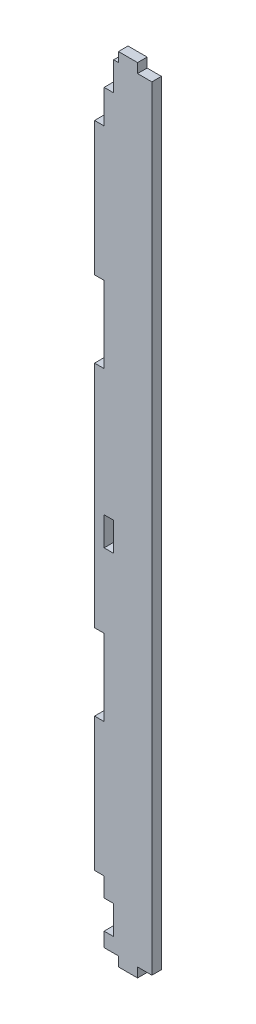
ISO-10303-21;
HEADER;
FILE_DESCRIPTION(('STEP AP214'),'2;1');
FILE_NAME('part.step','',(''),(''),'','','');
FILE_SCHEMA(('AUTOMOTIVE_DESIGN { 1 0 10303 214 1 1 1 1 }'));
ENDSEC;
DATA;
#1=APPLICATION_CONTEXT('core data for automotive mechanical design processes');
#2=APPLICATION_PROTOCOL_DEFINITION('international standard','automotive_design',2000,#1);
#3=PRODUCT_CONTEXT('',#1,'mechanical');
#4=PRODUCT('Part','Part','',(#3));
#5=PRODUCT_RELATED_PRODUCT_CATEGORY('part','',(#4));
#6=PRODUCT_DEFINITION_FORMATION('','',#4);
#7=PRODUCT_DEFINITION_CONTEXT('part definition',#1,'design');
#8=PRODUCT_DEFINITION('design','',#6,#7);
#9=PRODUCT_DEFINITION_SHAPE('','',#8);
#10=(LENGTH_UNIT() NAMED_UNIT(*) SI_UNIT(.MILLI.,.METRE.));
#11=(NAMED_UNIT(*) PLANE_ANGLE_UNIT() SI_UNIT($,.RADIAN.));
#12=(NAMED_UNIT(*) SI_UNIT($,.STERADIAN.) SOLID_ANGLE_UNIT());
#13=UNCERTAINTY_MEASURE_WITH_UNIT(LENGTH_MEASURE(1.E-05),#10,'distance_accuracy_value','');
#14=(GEOMETRIC_REPRESENTATION_CONTEXT(3) GLOBAL_UNCERTAINTY_ASSIGNED_CONTEXT((#13)) GLOBAL_UNIT_ASSIGNED_CONTEXT((#10,
#11,#12)) REPRESENTATION_CONTEXT('',''));
#15=CARTESIAN_POINT('',(0.,0.,0.));
#16=DIRECTION('',(0.,0.,1.));
#17=DIRECTION('',(1.,0.,0.));
#18=AXIS2_PLACEMENT_3D('',#15,#16,#17);
#19=CARTESIAN_POINT('',(0.,-472.5,5.));
#20=DIRECTION('',(0.,-1.,0.));
#21=DIRECTION('',(0.,0.,-1.));
#22=AXIS2_PLACEMENT_3D('',#19,#20,#21);
#23=PLANE('',#22);
#24=DIRECTION('',(-1.,0.,0.));
#25=VECTOR('',#24,1.);
#26=CARTESIAN_POINT('',(0.,-472.5,0.));
#27=LINE('',#26,#25);
#28=CARTESIAN_POINT('',(-435.,-472.5,0.));
#29=VERTEX_POINT('',#28);
#30=CARTESIAN_POINT('',(-440.,-472.5,0.));
#31=VERTEX_POINT('',#30);
#32=EDGE_CURVE('E305',#29,#31,#27,.T.);
#33=ORIENTED_EDGE('',*,*,#32,.T.);
#34=DIRECTION('',(0.,0.,-1.));
#35=VECTOR('',#34,1.);
#36=CARTESIAN_POINT('',(-440.,-472.5,5.));
#37=LINE('',#36,#35);
#38=CARTESIAN_POINT('',(-440.,-472.5,5.));
#39=VERTEX_POINT('',#38);
#40=EDGE_CURVE('E11',#39,#31,#37,.T.);
#41=ORIENTED_EDGE('',*,*,#40,.F.);
#42=DIRECTION('',(-1.,0.,0.));
#43=VECTOR('',#42,1.);
#44=CARTESIAN_POINT('',(0.,-472.5,5.));
#45=LINE('',#44,#43);
#46=CARTESIAN_POINT('',(-435.,-472.5,5.));
#47=VERTEX_POINT('',#46);
#48=EDGE_CURVE('E469',#47,#39,#45,.T.);
#49=ORIENTED_EDGE('',*,*,#48,.F.);
#50=DIRECTION('',(0.,0.,-1.));
#51=VECTOR('',#50,1.);
#52=CARTESIAN_POINT('',(-435.,-472.5,5.));
#53=LINE('',#52,#51);
#54=EDGE_CURVE('E382',#47,#29,#53,.T.);
#55=ORIENTED_EDGE('',*,*,#54,.T.);
#56=EDGE_LOOP('',(#33,#41,#49,#55));
#57=FACE_BOUND('',#56,.T.);
#58=ADVANCED_FACE('F39',(#57),#23,.F.);
#59=CARTESIAN_POINT('',(-439.999999999983,1.62832710278351E-11,5.));
#60=DIRECTION('',(1.,0.,0.));
#61=DIRECTION('',(0.,1.,0.));
#62=AXIS2_PLACEMENT_3D('',#59,#60,#61);
#63=PLANE('',#62);
#64=DIRECTION('',(0.,-1.,0.));
#65=VECTOR('',#64,1.);
#66=CARTESIAN_POINT('',(-439.999999999983,1.62832710278351E-11,0.));
#67=LINE('',#66,#65);
#68=CARTESIAN_POINT('',(-440.000000000001,-480.,0.));
#69=VERTEX_POINT('',#68);
#70=EDGE_CURVE('E308',#31,#69,#67,.T.);
#71=ORIENTED_EDGE('',*,*,#70,.T.);
#72=DIRECTION('',(0.,0.,-1.));
#73=VECTOR('',#72,1.);
#74=CARTESIAN_POINT('',(-440.000000000001,-480.,5.));
#75=LINE('',#74,#73);
#76=CARTESIAN_POINT('',(-440.000000000001,-480.,5.));
#77=VERTEX_POINT('',#76);
#78=EDGE_CURVE('E49',#77,#69,#75,.T.);
#79=ORIENTED_EDGE('',*,*,#78,.F.);
#80=DIRECTION('',(0.,-1.,0.));
#81=VECTOR('',#80,1.);
#82=CARTESIAN_POINT('',(-439.999999999983,1.62832710278351E-11,5.));
#83=LINE('',#82,#81);
#84=EDGE_CURVE('E472',#39,#77,#83,.T.);
#85=ORIENTED_EDGE('',*,*,#84,.F.);
#86=ORIENTED_EDGE('',*,*,#40,.T.);
#87=EDGE_LOOP('',(#71,#79,#85,#86));
#88=FACE_BOUND('',#87,.T.);
#89=ADVANCED_FACE('F556',(#88),#63,.F.);
#90=CARTESIAN_POINT('',(0.,-480.,5.));
#91=DIRECTION('',(0.,-1.,0.));
#92=DIRECTION('',(0.,0.,-1.));
#93=AXIS2_PLACEMENT_3D('',#90,#91,#92);
#94=PLANE('',#93);
#95=DIRECTION('',(-1.,0.,0.));
#96=VECTOR('',#95,1.);
#97=CARTESIAN_POINT('',(0.,-480.,0.));
#98=LINE('',#97,#96);
#99=CARTESIAN_POINT('',(-432.500000000001,-480.,0.));
#100=VERTEX_POINT('',#99);
#101=EDGE_CURVE('E311',#100,#69,#98,.T.);
#102=ORIENTED_EDGE('',*,*,#101,.F.);
#103=DIRECTION('',(0.,0.,-1.));
#104=VECTOR('',#103,1.);
#105=CARTESIAN_POINT('',(-432.500000000001,-480.,5.));
#106=LINE('',#105,#104);
#107=CARTESIAN_POINT('',(-432.500000000001,-480.,5.));
#108=VERTEX_POINT('',#107);
#109=EDGE_CURVE('E440',#108,#100,#106,.T.);
#110=ORIENTED_EDGE('',*,*,#109,.F.);
#111=DIRECTION('',(-1.,0.,0.));
#112=VECTOR('',#111,1.);
#113=CARTESIAN_POINT('',(0.,-480.,5.));
#114=LINE('',#113,#112);
#115=EDGE_CURVE('E478',#108,#77,#114,.T.);
#116=ORIENTED_EDGE('',*,*,#115,.T.);
#117=ORIENTED_EDGE('',*,*,#78,.T.);
#118=EDGE_LOOP('',(#102,#110,#116,#117));
#119=FACE_BOUND('',#118,.T.);
#120=ADVANCED_FACE('F561',(#119),#94,.T.);
#121=CARTESIAN_POINT('',(-432.500000000001,0.,5.));
#122=DIRECTION('',(-1.,0.,0.));
#123=DIRECTION('',(0.,0.,1.));
#124=AXIS2_PLACEMENT_3D('',#121,#122,#123);
#125=PLANE('',#124);
#126=DIRECTION('',(0.,1.,0.));
#127=VECTOR('',#126,1.);
#128=CARTESIAN_POINT('',(-432.500000000001,0.,0.));
#129=LINE('',#128,#127);
#130=CARTESIAN_POINT('',(-432.500000000001,-485.,0.));
#131=VERTEX_POINT('',#130);
#132=EDGE_CURVE('E314',#131,#100,#129,.T.);
#133=ORIENTED_EDGE('',*,*,#132,.F.);
#134=DIRECTION('',(0.,0.,-1.));
#135=VECTOR('',#134,1.);
#136=CARTESIAN_POINT('',(-432.500000000001,-485.,5.));
#137=LINE('',#136,#135);
#138=CARTESIAN_POINT('',(-432.500000000001,-485.,5.));
#139=VERTEX_POINT('',#138);
#140=EDGE_CURVE('E438',#139,#131,#137,.T.);
#141=ORIENTED_EDGE('',*,*,#140,.F.);
#142=DIRECTION('',(0.,1.,0.));
#143=VECTOR('',#142,1.);
#144=CARTESIAN_POINT('',(-432.500000000001,0.,5.));
#145=LINE('',#144,#143);
#146=EDGE_CURVE('E481',#139,#108,#145,.T.);
#147=ORIENTED_EDGE('',*,*,#146,.T.);
#148=ORIENTED_EDGE('',*,*,#109,.T.);
#149=EDGE_LOOP('',(#133,#141,#147,#148));
#150=FACE_BOUND('',#149,.T.);
#151=ADVANCED_FACE('F668',(#150),#125,.T.);
#152=CARTESIAN_POINT('',(0.,-485.,5.));
#153=DIRECTION('',(0.,-1.,0.));
#154=DIRECTION('',(0.,0.,-1.));
#155=AXIS2_PLACEMENT_3D('',#152,#153,#154);
#156=PLANE('',#155);
#157=DIRECTION('',(-1.,0.,0.));
#158=VECTOR('',#157,1.);
#159=CARTESIAN_POINT('',(0.,-485.,0.));
#160=LINE('',#159,#158);
#161=CARTESIAN_POINT('',(-422.500000000001,-485.,0.));
#162=VERTEX_POINT('',#161);
#163=EDGE_CURVE('E317',#162,#131,#160,.T.);
#164=ORIENTED_EDGE('',*,*,#163,.F.);
#165=DIRECTION('',(0.,0.,-1.));
#166=VECTOR('',#165,1.);
#167=CARTESIAN_POINT('',(-422.500000000001,-485.,5.));
#168=LINE('',#167,#166);
#169=CARTESIAN_POINT('',(-422.500000000001,-485.,5.));
#170=VERTEX_POINT('',#169);
#171=EDGE_CURVE('E436',#170,#162,#168,.T.);
#172=ORIENTED_EDGE('',*,*,#171,.F.);
#173=DIRECTION('',(-1.,0.,0.));
#174=VECTOR('',#173,1.);
#175=CARTESIAN_POINT('',(0.,-485.,5.));
#176=LINE('',#175,#174);
#177=EDGE_CURVE('E484',#170,#139,#176,.T.);
#178=ORIENTED_EDGE('',*,*,#177,.T.);
#179=ORIENTED_EDGE('',*,*,#140,.T.);
#180=EDGE_LOOP('',(#164,#172,#178,#179));
#181=FACE_BOUND('',#180,.T.);
#182=ADVANCED_FACE('F664',(#181),#156,.T.);
#183=CARTESIAN_POINT('',(-422.500000000001,0.,5.));
#184=DIRECTION('',(1.,0.,0.));
#185=DIRECTION('',(0.,0.,-1.));
#186=AXIS2_PLACEMENT_3D('',#183,#184,#185);
#187=PLANE('',#186);
#188=DIRECTION('',(0.,-1.,0.));
#189=VECTOR('',#188,1.);
#190=CARTESIAN_POINT('',(-422.500000000001,0.,0.));
#191=LINE('',#190,#189);
#192=CARTESIAN_POINT('',(-422.500000000001,-480.,0.));
#193=VERTEX_POINT('',#192);
#194=EDGE_CURVE('E320',#193,#162,#191,.T.);
#195=ORIENTED_EDGE('',*,*,#194,.F.);
#196=DIRECTION('',(0.,0.,-1.));
#197=VECTOR('',#196,1.);
#198=CARTESIAN_POINT('',(-422.500000000001,-480.,5.));
#199=LINE('',#198,#197);
#200=CARTESIAN_POINT('',(-422.500000000001,-480.,5.));
#201=VERTEX_POINT('',#200);
#202=EDGE_CURVE('E434',#201,#193,#199,.T.);
#203=ORIENTED_EDGE('',*,*,#202,.F.);
#204=DIRECTION('',(0.,-1.,0.));
#205=VECTOR('',#204,1.);
#206=CARTESIAN_POINT('',(-422.500000000001,0.,5.));
#207=LINE('',#206,#205);
#208=EDGE_CURVE('E487',#201,#170,#207,.T.);
#209=ORIENTED_EDGE('',*,*,#208,.T.);
#210=ORIENTED_EDGE('',*,*,#171,.T.);
#211=EDGE_LOOP('',(#195,#203,#209,#210));
#212=FACE_BOUND('',#211,.T.);
#213=ADVANCED_FACE('F660',(#212),#187,.T.);
#214=CARTESIAN_POINT('',(0.,-480.,5.));
#215=DIRECTION('',(0.,1.,0.));
#216=DIRECTION('',(0.,0.,1.));
#217=AXIS2_PLACEMENT_3D('',#214,#215,#216);
#218=PLANE('',#217);
#219=DIRECTION('',(1.,0.,0.));
#220=VECTOR('',#219,1.);
#221=CARTESIAN_POINT('',(0.,-480.,0.));
#222=LINE('',#221,#220);
#223=CARTESIAN_POINT('',(-415.000000000001,-480.,0.));
#224=VERTEX_POINT('',#223);
#225=EDGE_CURVE('E323',#193,#224,#222,.T.);
#226=ORIENTED_EDGE('',*,*,#225,.T.);
#227=DIRECTION('',(0.,0.,-1.));
#228=VECTOR('',#227,1.);
#229=CARTESIAN_POINT('',(-415.000000000001,-480.,5.));
#230=LINE('',#229,#228);
#231=CARTESIAN_POINT('',(-415.000000000001,-480.,5.));
#232=VERTEX_POINT('',#231);
#233=EDGE_CURVE('E432',#232,#224,#230,.T.);
#234=ORIENTED_EDGE('',*,*,#233,.F.);
#235=DIRECTION('',(1.,0.,0.));
#236=VECTOR('',#235,1.);
#237=CARTESIAN_POINT('',(0.,-480.,5.));
#238=LINE('',#237,#236);
#239=EDGE_CURVE('E490',#201,#232,#238,.T.);
#240=ORIENTED_EDGE('',*,*,#239,.F.);
#241=ORIENTED_EDGE('',*,*,#202,.T.);
#242=EDGE_LOOP('',(#226,#234,#240,#241));
#243=FACE_BOUND('',#242,.T.);
#244=ADVANCED_FACE('F656',(#243),#218,.F.);
#245=CARTESIAN_POINT('',(-415.000000000001,0.,5.));
#246=DIRECTION('',(1.,0.,0.));
#247=DIRECTION('',(0.,0.,-1.));
#248=AXIS2_PLACEMENT_3D('',#245,#246,#247);
#249=PLANE('',#248);
#250=DIRECTION('',(0.,-1.,0.));
#251=VECTOR('',#250,1.);
#252=CARTESIAN_POINT('',(-415.000000000001,0.,0.));
#253=LINE('',#252,#251);
#254=CARTESIAN_POINT('',(-415.000000000001,-75.,0.));
#255=VERTEX_POINT('',#254);
#256=EDGE_CURVE('E326',#255,#224,#253,.T.);
#257=ORIENTED_EDGE('',*,*,#256,.F.);
#258=DIRECTION('',(0.,0.,-1.));
#259=VECTOR('',#258,1.);
#260=CARTESIAN_POINT('',(-415.000000000001,-75.,5.));
#261=LINE('',#260,#259);
#262=CARTESIAN_POINT('',(-415.000000000001,-75.,5.));
#263=VERTEX_POINT('',#262);
#264=EDGE_CURVE('E430',#263,#255,#261,.T.);
#265=ORIENTED_EDGE('',*,*,#264,.F.);
#266=DIRECTION('',(0.,-1.,0.));
#267=VECTOR('',#266,1.);
#268=CARTESIAN_POINT('',(-415.000000000001,0.,5.));
#269=LINE('',#268,#267);
#270=EDGE_CURVE('E492',#263,#232,#269,.T.);
#271=ORIENTED_EDGE('',*,*,#270,.T.);
#272=ORIENTED_EDGE('',*,*,#233,.T.);
#273=EDGE_LOOP('',(#257,#265,#271,#272));
#274=FACE_BOUND('',#273,.T.);
#275=ADVANCED_FACE('F652',(#274),#249,.T.);
#276=CARTESIAN_POINT('',(0.,-75.,5.));
#277=DIRECTION('',(0.,1.,0.));
#278=DIRECTION('',(0.,0.,1.));
#279=AXIS2_PLACEMENT_3D('',#276,#277,#278);
#280=PLANE('',#279);
#281=DIRECTION('',(1.,0.,0.));
#282=VECTOR('',#281,1.);
#283=CARTESIAN_POINT('',(0.,-75.,0.));
#284=LINE('',#283,#282);
#285=CARTESIAN_POINT('',(-422.500000000001,-75.,0.));
#286=VERTEX_POINT('',#285);
#287=EDGE_CURVE('E329',#286,#255,#284,.T.);
#288=ORIENTED_EDGE('',*,*,#287,.F.);
#289=DIRECTION('',(0.,0.,-1.));
#290=VECTOR('',#289,1.);
#291=CARTESIAN_POINT('',(-422.500000000001,-75.,5.));
#292=LINE('',#291,#290);
#293=CARTESIAN_POINT('',(-422.500000000001,-75.,5.));
#294=VERTEX_POINT('',#293);
#295=EDGE_CURVE('E428',#294,#286,#292,.T.);
#296=ORIENTED_EDGE('',*,*,#295,.F.);
#297=DIRECTION('',(1.,0.,0.));
#298=VECTOR('',#297,1.);
#299=CARTESIAN_POINT('',(0.,-75.,5.));
#300=LINE('',#299,#298);
#301=EDGE_CURVE('E495',#294,#263,#300,.T.);
#302=ORIENTED_EDGE('',*,*,#301,.T.);
#303=ORIENTED_EDGE('',*,*,#264,.T.);
#304=EDGE_LOOP('',(#288,#296,#302,#303));
#305=FACE_BOUND('',#304,.T.);
#306=ADVANCED_FACE('F648',(#305),#280,.T.);
#307=CARTESIAN_POINT('',(-422.500000000001,0.,5.));
#308=DIRECTION('',(-1.,0.,0.));
#309=DIRECTION('',(0.,0.,1.));
#310=AXIS2_PLACEMENT_3D('',#307,#308,#309);
#311=PLANE('',#310);
#312=DIRECTION('',(0.,1.,0.));
#313=VECTOR('',#312,1.);
#314=CARTESIAN_POINT('',(-422.500000000001,0.,0.));
#315=LINE('',#314,#313);
#316=CARTESIAN_POINT('',(-422.500000000001,-70.,0.));
#317=VERTEX_POINT('',#316);
#318=EDGE_CURVE('E332',#286,#317,#315,.T.);
#319=ORIENTED_EDGE('',*,*,#318,.T.);
#320=DIRECTION('',(0.,0.,-1.));
#321=VECTOR('',#320,1.);
#322=CARTESIAN_POINT('',(-422.500000000001,-70.,5.));
#323=LINE('',#322,#321);
#324=CARTESIAN_POINT('',(-422.500000000001,-70.,5.));
#325=VERTEX_POINT('',#324);
#326=EDGE_CURVE('E425',#325,#317,#323,.T.);
#327=ORIENTED_EDGE('',*,*,#326,.F.);
#328=DIRECTION('',(0.,1.,0.));
#329=VECTOR('',#328,1.);
#330=CARTESIAN_POINT('',(-422.500000000001,0.,5.));
#331=LINE('',#330,#329);
#332=EDGE_CURVE('E498',#294,#325,#331,.T.);
#333=ORIENTED_EDGE('',*,*,#332,.F.);
#334=ORIENTED_EDGE('',*,*,#295,.T.);
#335=EDGE_LOOP('',(#319,#327,#333,#334));
#336=FACE_BOUND('',#335,.T.);
#337=ADVANCED_FACE('F644',(#336),#311,.F.);
#338=CARTESIAN_POINT('',(0.,-70.,5.));
#339=DIRECTION('',(0.,-1.,0.));
#340=DIRECTION('',(0.,0.,-1.));
#341=AXIS2_PLACEMENT_3D('',#338,#339,#340);
#342=PLANE('',#341);
#343=DIRECTION('',(-1.,0.,0.));
#344=VECTOR('',#343,1.);
#345=CARTESIAN_POINT('',(0.,-70.,0.));
#346=LINE('',#345,#344);
#347=CARTESIAN_POINT('',(-432.500000000001,-70.,0.));
#348=VERTEX_POINT('',#347);
#349=EDGE_CURVE('E334',#317,#348,#346,.T.);
#350=ORIENTED_EDGE('',*,*,#349,.T.);
#351=DIRECTION('',(0.,0.,-1.));
#352=VECTOR('',#351,1.);
#353=CARTESIAN_POINT('',(-432.500000000001,-70.,5.));
#354=LINE('',#353,#352);
#355=CARTESIAN_POINT('',(-432.500000000001,-70.,5.));
#356=VERTEX_POINT('',#355);
#357=EDGE_CURVE('E422',#356,#348,#354,.T.);
#358=ORIENTED_EDGE('',*,*,#357,.F.);
#359=DIRECTION('',(-1.,0.,0.));
#360=VECTOR('',#359,1.);
#361=CARTESIAN_POINT('',(0.,-70.,5.));
#362=LINE('',#361,#360);
#363=EDGE_CURVE('E500',#325,#356,#362,.T.);
#364=ORIENTED_EDGE('',*,*,#363,.F.);
#365=ORIENTED_EDGE('',*,*,#326,.T.);
#366=EDGE_LOOP('',(#350,#358,#364,#365));
#367=FACE_BOUND('',#366,.T.);
#368=ADVANCED_FACE('F640',(#367),#342,.F.);
#369=CARTESIAN_POINT('',(-432.500000000001,0.,5.));
#370=DIRECTION('',(1.,0.,0.));
#371=DIRECTION('',(0.,0.,-1.));
#372=AXIS2_PLACEMENT_3D('',#369,#370,#371);
#373=PLANE('',#372);
#374=DIRECTION('',(0.,-1.,0.));
#375=VECTOR('',#374,1.);
#376=CARTESIAN_POINT('',(-432.500000000001,0.,0.));
#377=LINE('',#376,#375);
#378=CARTESIAN_POINT('',(-432.500000000001,-75.,0.));
#379=VERTEX_POINT('',#378);
#380=EDGE_CURVE('E336',#348,#379,#377,.T.);
#381=ORIENTED_EDGE('',*,*,#380,.T.);
#382=DIRECTION('',(0.,0.,-1.));
#383=VECTOR('',#382,1.);
#384=CARTESIAN_POINT('',(-432.500000000001,-75.,5.));
#385=LINE('',#384,#383);
#386=CARTESIAN_POINT('',(-432.500000000001,-75.,5.));
#387=VERTEX_POINT('',#386);
#388=EDGE_CURVE('E419',#387,#379,#385,.T.);
#389=ORIENTED_EDGE('',*,*,#388,.F.);
#390=DIRECTION('',(0.,-1.,0.));
#391=VECTOR('',#390,1.);
#392=CARTESIAN_POINT('',(-432.500000000001,0.,5.));
#393=LINE('',#392,#391);
#394=EDGE_CURVE('E502',#356,#387,#393,.T.);
#395=ORIENTED_EDGE('',*,*,#394,.F.);
#396=ORIENTED_EDGE('',*,*,#357,.T.);
#397=EDGE_LOOP('',(#381,#389,#395,#396));
#398=FACE_BOUND('',#397,.T.);
#399=ADVANCED_FACE('F636',(#398),#373,.F.);
#400=CARTESIAN_POINT('',(0.,-75.,5.));
#401=DIRECTION('',(0.,-1.,0.));
#402=DIRECTION('',(0.,0.,-1.));
#403=AXIS2_PLACEMENT_3D('',#400,#401,#402);
#404=PLANE('',#403);
#405=DIRECTION('',(-1.,0.,0.));
#406=VECTOR('',#405,1.);
#407=CARTESIAN_POINT('',(0.,-75.,0.));
#408=LINE('',#407,#406);
#409=CARTESIAN_POINT('',(-435.000000000004,-75.,0.));
#410=VERTEX_POINT('',#409);
#411=EDGE_CURVE('E338',#379,#410,#408,.T.);
#412=ORIENTED_EDGE('',*,*,#411,.T.);
#413=DIRECTION('',(0.,0.,-1.));
#414=VECTOR('',#413,1.);
#415=CARTESIAN_POINT('',(-435.000000000004,-75.,5.));
#416=LINE('',#415,#414);
#417=CARTESIAN_POINT('',(-435.000000000004,-75.,5.));
#418=VERTEX_POINT('',#417);
#419=EDGE_CURVE('E416',#418,#410,#416,.T.);
#420=ORIENTED_EDGE('',*,*,#419,.F.);
#421=DIRECTION('',(-1.,0.,0.));
#422=VECTOR('',#421,1.);
#423=CARTESIAN_POINT('',(0.,-75.,5.));
#424=LINE('',#423,#422);
#425=EDGE_CURVE('E504',#387,#418,#424,.T.);
#426=ORIENTED_EDGE('',*,*,#425,.F.);
#427=ORIENTED_EDGE('',*,*,#388,.T.);
#428=EDGE_LOOP('',(#412,#420,#426,#427));
#429=FACE_BOUND('',#428,.T.);
#430=ADVANCED_FACE('F632',(#429),#404,.F.);
#431=CARTESIAN_POINT('',(-435.000000000004,0.,5.));
#432=DIRECTION('',(1.,0.,0.));
#433=DIRECTION('',(0.,0.,-1.));
#434=AXIS2_PLACEMENT_3D('',#431,#432,#433);
#435=PLANE('',#434);
#436=DIRECTION('',(0.,-1.,0.));
#437=VECTOR('',#436,1.);
#438=CARTESIAN_POINT('',(-435.000000000004,0.,0.));
#439=LINE('',#438,#437);
#440=CARTESIAN_POINT('',(-435.000000000004,-90.0000000000208,0.));
#441=VERTEX_POINT('',#440);
#442=EDGE_CURVE('E340',#410,#441,#439,.T.);
#443=ORIENTED_EDGE('',*,*,#442,.T.);
#444=DIRECTION('',(0.,0.,-1.));
#445=VECTOR('',#444,1.);
#446=CARTESIAN_POINT('',(-435.000000000004,-90.0000000000208,5.));
#447=LINE('',#446,#445);
#448=CARTESIAN_POINT('',(-435.000000000004,-90.0000000000208,5.));
#449=VERTEX_POINT('',#448);
#450=EDGE_CURVE('E413',#449,#441,#447,.T.);
#451=ORIENTED_EDGE('',*,*,#450,.F.);
#452=DIRECTION('',(0.,-1.,0.));
#453=VECTOR('',#452,1.);
#454=CARTESIAN_POINT('',(-435.000000000004,0.,5.));
#455=LINE('',#454,#453);
#456=EDGE_CURVE('E506',#418,#449,#455,.T.);
#457=ORIENTED_EDGE('',*,*,#456,.F.);
#458=ORIENTED_EDGE('',*,*,#419,.T.);
#459=EDGE_LOOP('',(#443,#451,#457,#458));
#460=FACE_BOUND('',#459,.T.);
#461=ADVANCED_FACE('F628',(#460),#435,.F.);
#462=CARTESIAN_POINT('',(0.,-90.0000000000208,5.));
#463=DIRECTION('',(0.,-1.,0.));
#464=DIRECTION('',(0.,0.,-1.));
#465=AXIS2_PLACEMENT_3D('',#462,#463,#464);
#466=PLANE('',#465);
#467=DIRECTION('',(-1.,0.,0.));
#468=VECTOR('',#467,1.);
#469=CARTESIAN_POINT('',(0.,-90.0000000000208,0.));
#470=LINE('',#469,#468);
#471=CARTESIAN_POINT('',(-440.000000000004,-90.0000000000208,0.));
#472=VERTEX_POINT('',#471);
#473=EDGE_CURVE('E342',#441,#472,#470,.T.);
#474=ORIENTED_EDGE('',*,*,#473,.T.);
#475=DIRECTION('',(0.,0.,-1.));
#476=VECTOR('',#475,1.);
#477=CARTESIAN_POINT('',(-440.000000000004,-90.0000000000208,5.));
#478=LINE('',#477,#476);
#479=CARTESIAN_POINT('',(-440.000000000004,-90.0000000000208,5.));
#480=VERTEX_POINT('',#479);
#481=EDGE_CURVE('E411',#480,#472,#478,.T.);
#482=ORIENTED_EDGE('',*,*,#481,.F.);
#483=DIRECTION('',(-1.,0.,0.));
#484=VECTOR('',#483,1.);
#485=CARTESIAN_POINT('',(0.,-90.0000000000208,5.));
#486=LINE('',#485,#484);
#487=EDGE_CURVE('E508',#449,#480,#486,.T.);
#488=ORIENTED_EDGE('',*,*,#487,.F.);
#489=ORIENTED_EDGE('',*,*,#450,.T.);
#490=EDGE_LOOP('',(#474,#482,#488,#489));
#491=FACE_BOUND('',#490,.T.);
#492=ADVANCED_FACE('F624',(#491),#466,.F.);
#493=CARTESIAN_POINT('',(-440.000000000025,-9.90953351123799E-11,5.));
#494=DIRECTION('',(-1.,-2.25216670709942E-13,0.));
#495=DIRECTION('',(2.25216670709942E-13,-1.,0.));
#496=AXIS2_PLACEMENT_3D('',#493,#494,#495);
#497=PLANE('',#496);
#498=DIRECTION('',(-2.25216670709942E-13,1.,0.));
#499=VECTOR('',#498,1.);
#500=CARTESIAN_POINT('',(-440.000000000025,-9.90953351123799E-11,0.));
#501=LINE('',#500,#499);
#502=CARTESIAN_POINT('',(-440.000000000001,-107.5,0.));
#503=VERTEX_POINT('',#502);
#504=EDGE_CURVE('E345',#503,#472,#501,.T.);
#505=ORIENTED_EDGE('',*,*,#504,.F.);
#506=DIRECTION('',(0.,0.,-1.));
#507=VECTOR('',#506,1.);
#508=CARTESIAN_POINT('',(-440.000000000001,-107.5,5.));
#509=LINE('',#508,#507);
#510=CARTESIAN_POINT('',(-440.000000000001,-107.5,5.));
#511=VERTEX_POINT('',#510);
#512=EDGE_CURVE('E409',#511,#503,#509,.T.);
#513=ORIENTED_EDGE('',*,*,#512,.F.);
#514=DIRECTION('',(-2.25216670709942E-13,1.,0.));
#515=VECTOR('',#514,1.);
#516=CARTESIAN_POINT('',(-440.000000000025,-9.90953351123799E-11,5.));
#517=LINE('',#516,#515);
#518=EDGE_CURVE('E510',#511,#480,#517,.T.);
#519=ORIENTED_EDGE('',*,*,#518,.T.);
#520=ORIENTED_EDGE('',*,*,#481,.T.);
#521=EDGE_LOOP('',(#505,#513,#519,#520));
#522=FACE_BOUND('',#521,.T.);
#523=ADVANCED_FACE('F620',(#522),#497,.T.);
#524=CARTESIAN_POINT('',(0.,-107.5,5.));
#525=DIRECTION('',(0.,-1.,0.));
#526=DIRECTION('',(0.,0.,-1.));
#527=AXIS2_PLACEMENT_3D('',#524,#525,#526);
#528=PLANE('',#527);
#529=DIRECTION('',(-1.,0.,0.));
#530=VECTOR('',#529,1.);
#531=CARTESIAN_POINT('',(0.,-107.5,0.));
#532=LINE('',#531,#530);
#533=CARTESIAN_POINT('',(-445.000000000001,-107.5,0.));
#534=VERTEX_POINT('',#533);
#535=EDGE_CURVE('E348',#503,#534,#532,.T.);
#536=ORIENTED_EDGE('',*,*,#535,.T.);
#537=DIRECTION('',(0.,0.,-1.));
#538=VECTOR('',#537,1.);
#539=CARTESIAN_POINT('',(-445.000000000001,-107.5,5.));
#540=LINE('',#539,#538);
#541=CARTESIAN_POINT('',(-445.000000000001,-107.5,5.));
#542=VERTEX_POINT('',#541);
#543=EDGE_CURVE('E406',#542,#534,#540,.T.);
#544=ORIENTED_EDGE('',*,*,#543,.F.);
#545=DIRECTION('',(-1.,0.,0.));
#546=VECTOR('',#545,1.);
#547=CARTESIAN_POINT('',(0.,-107.5,5.));
#548=LINE('',#547,#546);
#549=EDGE_CURVE('E513',#511,#542,#548,.T.);
#550=ORIENTED_EDGE('',*,*,#549,.F.);
#551=ORIENTED_EDGE('',*,*,#512,.T.);
#552=EDGE_LOOP('',(#536,#544,#550,#551));
#553=FACE_BOUND('',#552,.T.);
#554=ADVANCED_FACE('F616',(#553),#528,.F.);
#555=CARTESIAN_POINT('',(-445.000000000001,0.,5.));
#556=DIRECTION('',(1.,0.,0.));
#557=DIRECTION('',(0.,0.,-1.));
#558=AXIS2_PLACEMENT_3D('',#555,#556,#557);
#559=PLANE('',#558);
#560=DIRECTION('',(0.,-1.,0.));
#561=VECTOR('',#560,1.);
#562=CARTESIAN_POINT('',(-445.000000000001,0.,0.));
#563=LINE('',#562,#561);
#564=CARTESIAN_POINT('',(-445.000000000001,-177.5,0.));
#565=VERTEX_POINT('',#564);
#566=EDGE_CURVE('E350',#534,#565,#563,.T.);
#567=ORIENTED_EDGE('',*,*,#566,.T.);
#568=DIRECTION('',(0.,0.,-1.));
#569=VECTOR('',#568,1.);
#570=CARTESIAN_POINT('',(-445.000000000001,-177.5,5.));
#571=LINE('',#570,#569);
#572=CARTESIAN_POINT('',(-445.000000000001,-177.5,5.));
#573=VERTEX_POINT('',#572);
#574=EDGE_CURVE('E404',#573,#565,#571,.T.);
#575=ORIENTED_EDGE('',*,*,#574,.F.);
#576=DIRECTION('',(0.,-1.,0.));
#577=VECTOR('',#576,1.);
#578=CARTESIAN_POINT('',(-445.000000000001,0.,5.));
#579=LINE('',#578,#577);
#580=EDGE_CURVE('E515',#542,#573,#579,.T.);
#581=ORIENTED_EDGE('',*,*,#580,.F.);
#582=ORIENTED_EDGE('',*,*,#543,.T.);
#583=EDGE_LOOP('',(#567,#575,#581,#582));
#584=FACE_BOUND('',#583,.T.);
#585=ADVANCED_FACE('F612',(#584),#559,.F.);
#586=CARTESIAN_POINT('',(0.,-177.5,5.));
#587=DIRECTION('',(0.,-1.,0.));
#588=DIRECTION('',(0.,0.,-1.));
#589=AXIS2_PLACEMENT_3D('',#586,#587,#588);
#590=PLANE('',#589);
#591=DIRECTION('',(-1.,0.,0.));
#592=VECTOR('',#591,1.);
#593=CARTESIAN_POINT('',(0.,-177.5,0.));
#594=LINE('',#593,#592);
#595=CARTESIAN_POINT('',(-440.,-177.5,0.));
#596=VERTEX_POINT('',#595);
#597=EDGE_CURVE('E353',#596,#565,#594,.T.);
#598=ORIENTED_EDGE('',*,*,#597,.F.);
#599=DIRECTION('',(0.,0.,-1.));
#600=VECTOR('',#599,1.);
#601=CARTESIAN_POINT('',(-440.,-177.5,5.));
#602=LINE('',#601,#600);
#603=CARTESIAN_POINT('',(-440.,-177.5,5.));
#604=VERTEX_POINT('',#603);
#605=EDGE_CURVE('E402',#604,#596,#602,.T.);
#606=ORIENTED_EDGE('',*,*,#605,.F.);
#607=DIRECTION('',(-1.,0.,0.));
#608=VECTOR('',#607,1.);
#609=CARTESIAN_POINT('',(0.,-177.5,5.));
#610=LINE('',#609,#608);
#611=EDGE_CURVE('E517',#604,#573,#610,.T.);
#612=ORIENTED_EDGE('',*,*,#611,.T.);
#613=ORIENTED_EDGE('',*,*,#574,.T.);
#614=EDGE_LOOP('',(#598,#606,#612,#613));
#615=FACE_BOUND('',#614,.T.);
#616=ADVANCED_FACE('F608',(#615),#590,.T.);
#617=CARTESIAN_POINT('',(-440.,6.10622663543837E-13,5.));
#618=DIRECTION('',(-1.,0.,0.));
#619=DIRECTION('',(0.,-1.,0.));
#620=AXIS2_PLACEMENT_3D('',#617,#618,#619);
#621=PLANE('',#620);
#622=DIRECTION('',(0.,1.,0.));
#623=VECTOR('',#622,1.);
#624=CARTESIAN_POINT('',(-440.,6.10622663543837E-13,0.));
#625=LINE('',#624,#623);
#626=CARTESIAN_POINT('',(-440.,-217.5,0.));
#627=VERTEX_POINT('',#626);
#628=EDGE_CURVE('E356',#627,#596,#625,.T.);
#629=ORIENTED_EDGE('',*,*,#628,.F.);
#630=DIRECTION('',(0.,0.,-1.));
#631=VECTOR('',#630,1.);
#632=CARTESIAN_POINT('',(-440.,-217.5,5.));
#633=LINE('',#632,#631);
#634=CARTESIAN_POINT('',(-440.,-217.5,5.));
#635=VERTEX_POINT('',#634);
#636=EDGE_CURVE('E400',#635,#627,#633,.T.);
#637=ORIENTED_EDGE('',*,*,#636,.F.);
#638=DIRECTION('',(0.,1.,0.));
#639=VECTOR('',#638,1.);
#640=CARTESIAN_POINT('',(-440.,6.10622663543837E-13,5.));
#641=LINE('',#640,#639);
#642=EDGE_CURVE('E520',#635,#604,#641,.T.);
#643=ORIENTED_EDGE('',*,*,#642,.T.);
#644=ORIENTED_EDGE('',*,*,#605,.T.);
#645=EDGE_LOOP('',(#629,#637,#643,#644));
#646=FACE_BOUND('',#645,.T.);
#647=ADVANCED_FACE('F604',(#646),#621,.T.);
#648=CARTESIAN_POINT('',(0.,-217.5,5.));
#649=DIRECTION('',(0.,-1.,0.));
#650=DIRECTION('',(0.,0.,-1.));
#651=AXIS2_PLACEMENT_3D('',#648,#649,#650);
#652=PLANE('',#651);
#653=DIRECTION('',(-1.,0.,0.));
#654=VECTOR('',#653,1.);
#655=CARTESIAN_POINT('',(0.,-217.5,0.));
#656=LINE('',#655,#654);
#657=CARTESIAN_POINT('',(-445.,-217.5,0.));
#658=VERTEX_POINT('',#657);
#659=EDGE_CURVE('E359',#627,#658,#656,.T.);
#660=ORIENTED_EDGE('',*,*,#659,.T.);
#661=DIRECTION('',(0.,0.,-1.));
#662=VECTOR('',#661,1.);
#663=CARTESIAN_POINT('',(-445.,-217.5,5.));
#664=LINE('',#663,#662);
#665=CARTESIAN_POINT('',(-445.,-217.5,5.));
#666=VERTEX_POINT('',#665);
#667=EDGE_CURVE('E397',#666,#658,#664,.T.);
#668=ORIENTED_EDGE('',*,*,#667,.F.);
#669=DIRECTION('',(-1.,0.,0.));
#670=VECTOR('',#669,1.);
#671=CARTESIAN_POINT('',(0.,-217.5,5.));
#672=LINE('',#671,#670);
#673=EDGE_CURVE('E523',#635,#666,#672,.T.);
#674=ORIENTED_EDGE('',*,*,#673,.F.);
#675=ORIENTED_EDGE('',*,*,#636,.T.);
#676=EDGE_LOOP('',(#660,#668,#674,#675));
#677=FACE_BOUND('',#676,.T.);
#678=ADVANCED_FACE('F600',(#677),#652,.F.);
#679=CARTESIAN_POINT('',(-445.,0.,5.));
#680=DIRECTION('',(1.,0.,0.));
#681=DIRECTION('',(0.,0.,-1.));
#682=AXIS2_PLACEMENT_3D('',#679,#680,#681);
#683=PLANE('',#682);
#684=DIRECTION('',(0.,-1.,0.));
#685=VECTOR('',#684,1.);
#686=CARTESIAN_POINT('',(-445.,0.,0.));
#687=LINE('',#686,#685);
#688=CARTESIAN_POINT('',(-445.,-337.5,0.));
#689=VERTEX_POINT('',#688);
#690=EDGE_CURVE('E361',#658,#689,#687,.T.);
#691=ORIENTED_EDGE('',*,*,#690,.T.);
#692=DIRECTION('',(0.,0.,-1.));
#693=VECTOR('',#692,1.);
#694=CARTESIAN_POINT('',(-445.,-337.5,5.));
#695=LINE('',#694,#693);
#696=CARTESIAN_POINT('',(-445.,-337.5,5.));
#697=VERTEX_POINT('',#696);
#698=EDGE_CURVE('E395',#697,#689,#695,.T.);
#699=ORIENTED_EDGE('',*,*,#698,.F.);
#700=DIRECTION('',(0.,-1.,0.));
#701=VECTOR('',#700,1.);
#702=CARTESIAN_POINT('',(-445.,0.,5.));
#703=LINE('',#702,#701);
#704=EDGE_CURVE('E525',#666,#697,#703,.T.);
#705=ORIENTED_EDGE('',*,*,#704,.F.);
#706=ORIENTED_EDGE('',*,*,#667,.T.);
#707=EDGE_LOOP('',(#691,#699,#705,#706));
#708=FACE_BOUND('',#707,.T.);
#709=ADVANCED_FACE('F596',(#708),#683,.F.);
#710=CARTESIAN_POINT('',(0.,-337.5,5.));
#711=DIRECTION('',(0.,-1.,0.));
#712=DIRECTION('',(0.,0.,-1.));
#713=AXIS2_PLACEMENT_3D('',#710,#711,#712);
#714=PLANE('',#713);
#715=DIRECTION('',(-1.,0.,0.));
#716=VECTOR('',#715,1.);
#717=CARTESIAN_POINT('',(0.,-337.5,0.));
#718=LINE('',#717,#716);
#719=CARTESIAN_POINT('',(-440.,-337.5,0.));
#720=VERTEX_POINT('',#719);
#721=EDGE_CURVE('E364',#720,#689,#718,.T.);
#722=ORIENTED_EDGE('',*,*,#721,.F.);
#723=DIRECTION('',(0.,0.,-1.));
#724=VECTOR('',#723,1.);
#725=CARTESIAN_POINT('',(-440.,-337.5,5.));
#726=LINE('',#725,#724);
#727=CARTESIAN_POINT('',(-440.,-337.5,5.));
#728=VERTEX_POINT('',#727);
#729=EDGE_CURVE('E393',#728,#720,#726,.T.);
#730=ORIENTED_EDGE('',*,*,#729,.F.);
#731=DIRECTION('',(-1.,0.,0.));
#732=VECTOR('',#731,1.);
#733=CARTESIAN_POINT('',(0.,-337.5,5.));
#734=LINE('',#733,#732);
#735=EDGE_CURVE('E527',#728,#697,#734,.T.);
#736=ORIENTED_EDGE('',*,*,#735,.T.);
#737=ORIENTED_EDGE('',*,*,#698,.T.);
#738=EDGE_LOOP('',(#722,#730,#736,#737));
#739=FACE_BOUND('',#738,.T.);
#740=ADVANCED_FACE('F592',(#739),#714,.T.);
#741=CARTESIAN_POINT('',(-439.999999999999,1.83186799063151E-12,5.));
#742=DIRECTION('',(1.,0.,0.));
#743=DIRECTION('',(0.,1.,0.));
#744=AXIS2_PLACEMENT_3D('',#741,#742,#743);
#745=PLANE('',#744);
#746=DIRECTION('',(0.,-1.,0.));
#747=VECTOR('',#746,1.);
#748=CARTESIAN_POINT('',(-439.999999999999,1.83186799063151E-12,0.));
#749=LINE('',#748,#747);
#750=CARTESIAN_POINT('',(-440.000000000001,-377.5,0.));
#751=VERTEX_POINT('',#750);
#752=EDGE_CURVE('E367',#720,#751,#749,.T.);
#753=ORIENTED_EDGE('',*,*,#752,.T.);
#754=DIRECTION('',(0.,0.,-1.));
#755=VECTOR('',#754,1.);
#756=CARTESIAN_POINT('',(-440.000000000001,-377.5,5.));
#757=LINE('',#756,#755);
#758=CARTESIAN_POINT('',(-440.000000000001,-377.5,5.));
#759=VERTEX_POINT('',#758);
#760=EDGE_CURVE('E390',#759,#751,#757,.T.);
#761=ORIENTED_EDGE('',*,*,#760,.F.);
#762=DIRECTION('',(0.,-1.,0.));
#763=VECTOR('',#762,1.);
#764=CARTESIAN_POINT('',(-439.999999999999,1.83186799063151E-12,5.));
#765=LINE('',#764,#763);
#766=EDGE_CURVE('E530',#728,#759,#765,.T.);
#767=ORIENTED_EDGE('',*,*,#766,.F.);
#768=ORIENTED_EDGE('',*,*,#729,.T.);
#769=EDGE_LOOP('',(#753,#761,#767,#768));
#770=FACE_BOUND('',#769,.T.);
#771=ADVANCED_FACE('F588',(#770),#745,.F.);
#772=CARTESIAN_POINT('',(0.,-377.5,5.));
#773=DIRECTION('',(0.,-1.,0.));
#774=DIRECTION('',(0.,0.,-1.));
#775=AXIS2_PLACEMENT_3D('',#772,#773,#774);
#776=PLANE('',#775);
#777=DIRECTION('',(-1.,0.,0.));
#778=VECTOR('',#777,1.);
#779=CARTESIAN_POINT('',(0.,-377.5,0.));
#780=LINE('',#779,#778);
#781=CARTESIAN_POINT('',(-445.000000000001,-377.5,0.));
#782=VERTEX_POINT('',#781);
#783=EDGE_CURVE('E369',#751,#782,#780,.T.);
#784=ORIENTED_EDGE('',*,*,#783,.T.);
#785=DIRECTION('',(0.,0.,-1.));
#786=VECTOR('',#785,1.);
#787=CARTESIAN_POINT('',(-445.000000000001,-377.5,5.));
#788=LINE('',#787,#786);
#789=CARTESIAN_POINT('',(-445.000000000001,-377.5,5.));
#790=VERTEX_POINT('',#789);
#791=EDGE_CURVE('E388',#790,#782,#788,.T.);
#792=ORIENTED_EDGE('',*,*,#791,.F.);
#793=DIRECTION('',(-1.,0.,0.));
#794=VECTOR('',#793,1.);
#795=CARTESIAN_POINT('',(0.,-377.5,5.));
#796=LINE('',#795,#794);
#797=EDGE_CURVE('E532',#759,#790,#796,.T.);
#798=ORIENTED_EDGE('',*,*,#797,.F.);
#799=ORIENTED_EDGE('',*,*,#760,.T.);
#800=EDGE_LOOP('',(#784,#792,#798,#799));
#801=FACE_BOUND('',#800,.T.);
#802=ADVANCED_FACE('F584',(#801),#776,.F.);
#803=CARTESIAN_POINT('',(-445.000000000001,0.,5.));
#804=DIRECTION('',(-1.,0.,0.));
#805=DIRECTION('',(0.,0.,1.));
#806=AXIS2_PLACEMENT_3D('',#803,#804,#805);
#807=PLANE('',#806);
#808=DIRECTION('',(0.,1.,0.));
#809=VECTOR('',#808,1.);
#810=CARTESIAN_POINT('',(-445.000000000001,0.,0.));
#811=LINE('',#810,#809);
#812=CARTESIAN_POINT('',(-445.000000000001,-447.5,0.));
#813=VERTEX_POINT('',#812);
#814=EDGE_CURVE('E372',#813,#782,#811,.T.);
#815=ORIENTED_EDGE('',*,*,#814,.F.);
#816=DIRECTION('',(0.,0.,-1.));
#817=VECTOR('',#816,1.);
#818=CARTESIAN_POINT('',(-445.000000000001,-447.5,5.));
#819=LINE('',#818,#817);
#820=CARTESIAN_POINT('',(-445.000000000001,-447.5,5.));
#821=VERTEX_POINT('',#820);
#822=EDGE_CURVE('E386',#821,#813,#819,.T.);
#823=ORIENTED_EDGE('',*,*,#822,.F.);
#824=DIRECTION('',(0.,1.,0.));
#825=VECTOR('',#824,1.);
#826=CARTESIAN_POINT('',(-445.000000000001,0.,5.));
#827=LINE('',#826,#825);
#828=EDGE_CURVE('E534',#821,#790,#827,.T.);
#829=ORIENTED_EDGE('',*,*,#828,.T.);
#830=ORIENTED_EDGE('',*,*,#791,.T.);
#831=EDGE_LOOP('',(#815,#823,#829,#830));
#832=FACE_BOUND('',#831,.T.);
#833=ADVANCED_FACE('F581',(#832),#807,.T.);
#834=CARTESIAN_POINT('',(0.,-447.5,5.));
#835=DIRECTION('',(0.,-1.,0.));
#836=DIRECTION('',(0.,0.,-1.));
#837=AXIS2_PLACEMENT_3D('',#834,#835,#836);
#838=PLANE('',#837);
#839=DIRECTION('',(-1.,0.,0.));
#840=VECTOR('',#839,1.);
#841=CARTESIAN_POINT('',(0.,-447.5,0.));
#842=LINE('',#841,#840);
#843=CARTESIAN_POINT('',(-440.000000000001,-447.5,0.));
#844=VERTEX_POINT('',#843);
#845=EDGE_CURVE('E375',#844,#813,#842,.T.);
#846=ORIENTED_EDGE('',*,*,#845,.F.);
#847=DIRECTION('',(0.,0.,-1.));
#848=VECTOR('',#847,1.);
#849=CARTESIAN_POINT('',(-440.000000000001,-447.5,5.));
#850=LINE('',#849,#848);
#851=CARTESIAN_POINT('',(-440.000000000001,-447.5,5.));
#852=VERTEX_POINT('',#851);
#853=EDGE_CURVE('E287',#852,#844,#850,.T.);
#854=ORIENTED_EDGE('',*,*,#853,.F.);
#855=DIRECTION('',(-1.,0.,0.));
#856=VECTOR('',#855,1.);
#857=CARTESIAN_POINT('',(0.,-447.5,5.));
#858=LINE('',#857,#856);
#859=EDGE_CURVE('E280',#852,#821,#858,.T.);
#860=ORIENTED_EDGE('',*,*,#859,.T.);
#861=ORIENTED_EDGE('',*,*,#822,.T.);
#862=EDGE_LOOP('',(#846,#854,#860,#861));
#863=FACE_BOUND('',#862,.T.);
#864=ADVANCED_FACE('F538',(#863),#838,.T.);
#865=CARTESIAN_POINT('',(-440.000000000011,-9.76996261670149E-12,5.));
#866=DIRECTION('',(1.,0.,0.));
#867=DIRECTION('',(0.,1.,0.));
#868=AXIS2_PLACEMENT_3D('',#865,#866,#867);
#869=PLANE('',#868);
#870=DIRECTION('',(0.,-1.,0.));
#871=VECTOR('',#870,1.);
#872=CARTESIAN_POINT('',(-440.000000000011,-9.76996261670149E-12,0.));
#873=LINE('',#872,#871);
#874=CARTESIAN_POINT('',(-440.,-457.5,0.));
#875=VERTEX_POINT('',#874);
#876=EDGE_CURVE('E286',#844,#875,#873,.T.);
#877=ORIENTED_EDGE('',*,*,#876,.T.);
#878=DIRECTION('',(0.,0.,-1.));
#879=VECTOR('',#878,1.);
#880=CARTESIAN_POINT('',(-440.,-457.5,5.));
#881=LINE('',#880,#879);
#882=CARTESIAN_POINT('',(-440.,-457.5,5.));
#883=VERTEX_POINT('',#882);
#884=EDGE_CURVE('E283',#883,#875,#881,.T.);
#885=ORIENTED_EDGE('',*,*,#884,.F.);
#886=DIRECTION('',(0.,-1.,0.));
#887=VECTOR('',#886,1.);
#888=CARTESIAN_POINT('',(-440.000000000011,-9.76996261670149E-12,5.));
#889=LINE('',#888,#887);
#890=EDGE_CURVE('E273',#852,#883,#889,.T.);
#891=ORIENTED_EDGE('',*,*,#890,.F.);
#892=ORIENTED_EDGE('',*,*,#853,.T.);
#893=EDGE_LOOP('',(#877,#885,#891,#892));
#894=FACE_BOUND('',#893,.T.);
#895=ADVANCED_FACE('F284',(#894),#869,.F.);
#896=CARTESIAN_POINT('',(0.,-457.5,5.));
#897=DIRECTION('',(0.,1.,0.));
#898=DIRECTION('',(0.,0.,1.));
#899=AXIS2_PLACEMENT_3D('',#896,#897,#898);
#900=PLANE('',#899);
#901=DIRECTION('',(1.,0.,0.));
#902=VECTOR('',#901,1.);
#903=CARTESIAN_POINT('',(0.,-457.5,0.));
#904=LINE('',#903,#902);
#905=CARTESIAN_POINT('',(-435.,-457.5,0.));
#906=VERTEX_POINT('',#905);
#907=EDGE_CURVE('E165',#875,#906,#904,.T.);
#908=ORIENTED_EDGE('',*,*,#907,.T.);
#909=DIRECTION('',(0.,0.,-1.));
#910=VECTOR('',#909,1.);
#911=CARTESIAN_POINT('',(-435.,-457.5,5.));
#912=LINE('',#911,#910);
#913=CARTESIAN_POINT('',(-435.,-457.5,5.));
#914=VERTEX_POINT('',#913);
#915=EDGE_CURVE('E288',#914,#906,#912,.T.);
#916=ORIENTED_EDGE('',*,*,#915,.F.);
#917=DIRECTION('',(1.,0.,0.));
#918=VECTOR('',#917,1.);
#919=CARTESIAN_POINT('',(0.,-457.5,5.));
#920=LINE('',#919,#918);
#921=EDGE_CURVE('E277',#883,#914,#920,.T.);
#922=ORIENTED_EDGE('',*,*,#921,.F.);
#923=ORIENTED_EDGE('',*,*,#884,.T.);
#924=EDGE_LOOP('',(#908,#916,#922,#923));
#925=FACE_BOUND('',#924,.T.);
#926=ADVANCED_FACE('F290',(#925),#900,.F.);
#927=CARTESIAN_POINT('',(-3.15025783237731E-11,-283.750000000054,5.));
#928=DIRECTION('',(1.11022302462615E-13,1.,0.));
#929=DIRECTION('',(-1.,1.11022302462615E-13,0.));
#930=AXIS2_PLACEMENT_3D('',#927,#928,#929);
#931=PLANE('',#930);
#932=DIRECTION('',(1.,-1.11022302462615E-13,0.));
#933=VECTOR('',#932,1.);
#934=CARTESIAN_POINT('',(-3.15025783237731E-11,-283.750000000054,0.));
#935=LINE('',#934,#933);
#936=CARTESIAN_POINT('',(-439.999999999997,-283.750000000005,0.));
#937=VERTEX_POINT('',#936);
#938=CARTESIAN_POINT('',(-435.000000000001,-283.750000000006,0.));
#939=VERTEX_POINT('',#938);
#940=EDGE_CURVE('E296',#937,#939,#935,.T.);
#941=ORIENTED_EDGE('',*,*,#940,.T.);
#942=DIRECTION('',(0.,0.,-1.));
#943=VECTOR('',#942,1.);
#944=CARTESIAN_POINT('',(-435.000000000001,-283.750000000006,5.));
#945=LINE('',#944,#943);
#946=CARTESIAN_POINT('',(-435.000000000001,-283.750000000006,5.));
#947=VERTEX_POINT('',#946);
#948=EDGE_CURVE('E43',#947,#939,#945,.T.);
#949=ORIENTED_EDGE('',*,*,#948,.F.);
#950=DIRECTION('',(1.,-1.11022302462615E-13,0.));
#951=VECTOR('',#950,1.);
#952=CARTESIAN_POINT('',(-3.15025783237731E-11,-283.750000000054,5.));
#953=LINE('',#952,#951);
#954=CARTESIAN_POINT('',(-439.999999999997,-283.750000000005,5.));
#955=VERTEX_POINT('',#954);
#956=EDGE_CURVE('E381',#955,#947,#953,.T.);
#957=ORIENTED_EDGE('',*,*,#956,.F.);
#958=DIRECTION('',(0.,0.,-1.));
#959=VECTOR('',#958,1.);
#960=CARTESIAN_POINT('',(-439.999999999997,-283.750000000005,5.));
#961=LINE('',#960,#959);
#962=EDGE_CURVE('E292',#955,#937,#961,.T.);
#963=ORIENTED_EDGE('',*,*,#962,.T.);
#964=EDGE_LOOP('',(#941,#949,#957,#963));
#965=FACE_BOUND('',#964,.T.);
#966=ADVANCED_FACE('F41',(#965),#931,.F.);
#967=CARTESIAN_POINT('',(-435.000000000083,-1.25566224085134E-10,5.));
#968=DIRECTION('',(1.,2.88657986402552E-13,0.));
#969=DIRECTION('',(-2.88657986402552E-13,1.,0.));
#970=AXIS2_PLACEMENT_3D('',#967,#968,#969);
#971=PLANE('',#970);
#972=DIRECTION('',(2.88657986402552E-13,-1.,0.));
#973=VECTOR('',#972,1.);
#974=CARTESIAN_POINT('',(-435.000000000083,-1.25566224085134E-10,0.));
#975=LINE('',#974,#973);
#976=CARTESIAN_POINT('',(-434.999999999997,-298.750000000005,0.));
#977=VERTEX_POINT('',#976);
#978=EDGE_CURVE('E299',#939,#977,#975,.T.);
#979=ORIENTED_EDGE('',*,*,#978,.T.);
#980=DIRECTION('',(0.,0.,-1.));
#981=VECTOR('',#980,1.);
#982=CARTESIAN_POINT('',(-434.999999999997,-298.750000000005,5.));
#983=LINE('',#982,#981);
#984=CARTESIAN_POINT('',(-434.999999999997,-298.750000000005,5.));
#985=VERTEX_POINT('',#984);
#986=EDGE_CURVE('E447',#985,#977,#983,.T.);
#987=ORIENTED_EDGE('',*,*,#986,.F.);
#988=DIRECTION('',(2.88657986402552E-13,-1.,0.));
#989=VECTOR('',#988,1.);
#990=CARTESIAN_POINT('',(-435.000000000083,-1.25566224085134E-10,5.));
#991=LINE('',#990,#989);
#992=EDGE_CURVE('E180',#947,#985,#991,.T.);
#993=ORIENTED_EDGE('',*,*,#992,.F.);
#994=ORIENTED_EDGE('',*,*,#948,.T.);
#995=EDGE_LOOP('',(#979,#987,#993,#994));
#996=FACE_BOUND('',#995,.T.);
#997=ADVANCED_FACE('F453',(#996),#971,.F.);
#998=CARTESIAN_POINT('',(0.,-298.750000000005,5.));
#999=DIRECTION('',(0.,-1.,0.));
#1000=DIRECTION('',(0.,0.,-1.));
#1001=AXIS2_PLACEMENT_3D('',#998,#999,#1000);
#1002=PLANE('',#1001);
#1003=DIRECTION('',(-1.,0.,0.));
#1004=VECTOR('',#1003,1.);
#1005=CARTESIAN_POINT('',(0.,-298.750000000005,0.));
#1006=LINE('',#1005,#1004);
#1007=CARTESIAN_POINT('',(-439.999999999997,-298.750000000005,0.));
#1008=VERTEX_POINT('',#1007);
#1009=EDGE_CURVE('E301',#977,#1008,#1006,.T.);
#1010=ORIENTED_EDGE('',*,*,#1009,.T.);
#1011=DIRECTION('',(0.,0.,-1.));
#1012=VECTOR('',#1011,1.);
#1013=CARTESIAN_POINT('',(-439.999999999997,-298.750000000005,5.));
#1014=LINE('',#1013,#1012);
#1015=CARTESIAN_POINT('',(-439.999999999997,-298.750000000005,5.));
#1016=VERTEX_POINT('',#1015);
#1017=EDGE_CURVE('E445',#1016,#1008,#1014,.T.);
#1018=ORIENTED_EDGE('',*,*,#1017,.F.);
#1019=DIRECTION('',(-1.,0.,0.));
#1020=VECTOR('',#1019,1.);
#1021=CARTESIAN_POINT('',(0.,-298.750000000005,5.));
#1022=LINE('',#1021,#1020);
#1023=EDGE_CURVE('E470',#985,#1016,#1022,.T.);
#1024=ORIENTED_EDGE('',*,*,#1023,.F.);
#1025=ORIENTED_EDGE('',*,*,#986,.T.);
#1026=EDGE_LOOP('',(#1010,#1018,#1024,#1025));
#1027=FACE_BOUND('',#1026,.T.);
#1028=ADVANCED_FACE('F463',(#1027),#1002,.F.);
#1029=CARTESIAN_POINT('',(-439.999999999997,0.,5.));
#1030=DIRECTION('',(-1.,0.,0.));
#1031=DIRECTION('',(0.,0.,1.));
#1032=AXIS2_PLACEMENT_3D('',#1029,#1030,#1031);
#1033=PLANE('',#1032);
#1034=DIRECTION('',(0.,1.,0.));
#1035=VECTOR('',#1034,1.);
#1036=CARTESIAN_POINT('',(-439.999999999997,0.,0.));
#1037=LINE('',#1036,#1035);
#1038=EDGE_CURVE('E303',#1008,#937,#1037,.T.);
#1039=ORIENTED_EDGE('',*,*,#1038,.T.);
#1040=ORIENTED_EDGE('',*,*,#962,.F.);
#1041=DIRECTION('',(0.,1.,0.));
#1042=VECTOR('',#1041,1.);
#1043=CARTESIAN_POINT('',(-439.999999999997,0.,5.));
#1044=LINE('',#1043,#1042);
#1045=EDGE_CURVE('E467',#1016,#955,#1044,.T.);
#1046=ORIENTED_EDGE('',*,*,#1045,.F.);
#1047=ORIENTED_EDGE('',*,*,#1017,.T.);
#1048=EDGE_LOOP('',(#1039,#1040,#1046,#1047));
#1049=FACE_BOUND('',#1048,.T.);
#1050=ADVANCED_FACE('F466',(#1049),#1033,.F.);
#1051=CARTESIAN_POINT('',(-435.,0.,5.));
#1052=DIRECTION('',(1.,0.,0.));
#1053=DIRECTION('',(0.,0.,-1.));
#1054=AXIS2_PLACEMENT_3D('',#1051,#1052,#1053);
#1055=PLANE('',#1054);
#1056=DIRECTION('',(0.,-1.,0.));
#1057=VECTOR('',#1056,1.);
#1058=CARTESIAN_POINT('',(-435.,0.,0.));
#1059=LINE('',#1058,#1057);
#1060=EDGE_CURVE('E171',#906,#29,#1059,.T.);
#1061=ORIENTED_EDGE('',*,*,#1060,.T.);
#1062=ORIENTED_EDGE('',*,*,#54,.F.);
#1063=DIRECTION('',(0.,-1.,0.));
#1064=VECTOR('',#1063,1.);
#1065=CARTESIAN_POINT('',(-435.,0.,5.));
#1066=LINE('',#1065,#1064);
#1067=EDGE_CURVE('E58',#914,#47,#1066,.T.);
#1068=ORIENTED_EDGE('',*,*,#1067,.F.);
#1069=ORIENTED_EDGE('',*,*,#915,.T.);
#1070=EDGE_LOOP('',(#1061,#1062,#1068,#1069));
#1071=FACE_BOUND('',#1070,.T.);
#1072=ADVANCED_FACE('F544',(#1071),#1055,.F.);
#1073=CARTESIAN_POINT('',(0.,0.,5.));
#1074=DIRECTION('',(0.,0.,1.));
#1075=DIRECTION('',(1.,0.,0.));
#1076=AXIS2_PLACEMENT_3D('',#1073,#1074,#1075);
#1077=PLANE('',#1076);
#1078=ORIENTED_EDGE('',*,*,#956,.T.);
#1079=ORIENTED_EDGE('',*,*,#992,.T.);
#1080=ORIENTED_EDGE('',*,*,#1023,.T.);
#1081=ORIENTED_EDGE('',*,*,#1045,.T.);
#1082=EDGE_LOOP('',(#1078,#1079,#1080,#1081));
#1083=FACE_BOUND('',#1082,.T.);
#1084=ORIENTED_EDGE('',*,*,#48,.T.);
#1085=ORIENTED_EDGE('',*,*,#84,.T.);
#1086=ORIENTED_EDGE('',*,*,#115,.F.);
#1087=ORIENTED_EDGE('',*,*,#146,.F.);
#1088=ORIENTED_EDGE('',*,*,#177,.F.);
#1089=ORIENTED_EDGE('',*,*,#208,.F.);
#1090=ORIENTED_EDGE('',*,*,#239,.T.);
#1091=ORIENTED_EDGE('',*,*,#270,.F.);
#1092=ORIENTED_EDGE('',*,*,#301,.F.);
#1093=ORIENTED_EDGE('',*,*,#332,.T.);
#1094=ORIENTED_EDGE('',*,*,#363,.T.);
#1095=ORIENTED_EDGE('',*,*,#394,.T.);
#1096=ORIENTED_EDGE('',*,*,#425,.T.);
#1097=ORIENTED_EDGE('',*,*,#456,.T.);
#1098=ORIENTED_EDGE('',*,*,#487,.T.);
#1099=ORIENTED_EDGE('',*,*,#518,.F.);
#1100=ORIENTED_EDGE('',*,*,#549,.T.);
#1101=ORIENTED_EDGE('',*,*,#580,.T.);
#1102=ORIENTED_EDGE('',*,*,#611,.F.);
#1103=ORIENTED_EDGE('',*,*,#642,.F.);
#1104=ORIENTED_EDGE('',*,*,#673,.T.);
#1105=ORIENTED_EDGE('',*,*,#704,.T.);
#1106=ORIENTED_EDGE('',*,*,#735,.F.);
#1107=ORIENTED_EDGE('',*,*,#766,.T.);
#1108=ORIENTED_EDGE('',*,*,#797,.T.);
#1109=ORIENTED_EDGE('',*,*,#828,.F.);
#1110=ORIENTED_EDGE('',*,*,#859,.F.);
#1111=ORIENTED_EDGE('',*,*,#890,.T.);
#1112=ORIENTED_EDGE('',*,*,#921,.T.);
#1113=ORIENTED_EDGE('',*,*,#1067,.T.);
#1114=EDGE_LOOP('',(#1084,#1085,#1086,#1087,#1088,#1089,#1090,#1091,#1092,#1093,#1094,#1095,
#1096,#1097,#1098,#1099,#1100,#1101,#1102,#1103,#1104,#1105,#1106,#1107,#1108,#1109,#1110,#1111,
#1112,#1113));
#1115=FACE_BOUND('',#1114,.T.);
#1116=ADVANCED_FACE('F275',(#1083,#1115),#1077,.T.);
#1117=CARTESIAN_POINT('',(0.,0.,0.));
#1118=DIRECTION('',(0.,0.,1.));
#1119=DIRECTION('',(1.,0.,0.));
#1120=AXIS2_PLACEMENT_3D('',#1117,#1118,#1119);
#1121=PLANE('',#1120);
#1122=ORIENTED_EDGE('',*,*,#940,.F.);
#1123=ORIENTED_EDGE('',*,*,#1038,.F.);
#1124=ORIENTED_EDGE('',*,*,#1009,.F.);
#1125=ORIENTED_EDGE('',*,*,#978,.F.);
#1126=EDGE_LOOP('',(#1122,#1123,#1124,#1125));
#1127=FACE_BOUND('',#1126,.T.);
#1128=ORIENTED_EDGE('',*,*,#32,.F.);
#1129=ORIENTED_EDGE('',*,*,#1060,.F.);
#1130=ORIENTED_EDGE('',*,*,#907,.F.);
#1131=ORIENTED_EDGE('',*,*,#876,.F.);
#1132=ORIENTED_EDGE('',*,*,#845,.T.);
#1133=ORIENTED_EDGE('',*,*,#814,.T.);
#1134=ORIENTED_EDGE('',*,*,#783,.F.);
#1135=ORIENTED_EDGE('',*,*,#752,.F.);
#1136=ORIENTED_EDGE('',*,*,#721,.T.);
#1137=ORIENTED_EDGE('',*,*,#690,.F.);
#1138=ORIENTED_EDGE('',*,*,#659,.F.);
#1139=ORIENTED_EDGE('',*,*,#628,.T.);
#1140=ORIENTED_EDGE('',*,*,#597,.T.);
#1141=ORIENTED_EDGE('',*,*,#566,.F.);
#1142=ORIENTED_EDGE('',*,*,#535,.F.);
#1143=ORIENTED_EDGE('',*,*,#504,.T.);
#1144=ORIENTED_EDGE('',*,*,#473,.F.);
#1145=ORIENTED_EDGE('',*,*,#442,.F.);
#1146=ORIENTED_EDGE('',*,*,#411,.F.);
#1147=ORIENTED_EDGE('',*,*,#380,.F.);
#1148=ORIENTED_EDGE('',*,*,#349,.F.);
#1149=ORIENTED_EDGE('',*,*,#318,.F.);
#1150=ORIENTED_EDGE('',*,*,#287,.T.);
#1151=ORIENTED_EDGE('',*,*,#256,.T.);
#1152=ORIENTED_EDGE('',*,*,#225,.F.);
#1153=ORIENTED_EDGE('',*,*,#194,.T.);
#1154=ORIENTED_EDGE('',*,*,#163,.T.);
#1155=ORIENTED_EDGE('',*,*,#132,.T.);
#1156=ORIENTED_EDGE('',*,*,#101,.T.);
#1157=ORIENTED_EDGE('',*,*,#70,.F.);
#1158=EDGE_LOOP('',(#1128,#1129,#1130,#1131,#1132,#1133,#1134,#1135,#1136,#1137,#1138,#1139,
#1140,#1141,#1142,#1143,#1144,#1145,#1146,#1147,#1148,#1149,#1150,#1151,#1152,#1153,#1154,#1155,
#1156,#1157));
#1159=FACE_BOUND('',#1158,.T.);
#1160=ADVANCED_FACE('F460',(#1127,#1159),#1121,.F.);
#1161=CLOSED_SHELL('',(#58,#89,#120,#151,#182,#213,#244,#275,#306,#337,#368,#399,#430,#461,#492,
#523,#554,#585,#616,#647,#678,#709,#740,#771,#802,#833,#864,#895,#926,#966,#997,#1028,#1050,
#1072,#1116,#1160));
#1162=MANIFOLD_SOLID_BREP('B2',#1161);
#1163=ADVANCED_BREP_SHAPE_REPRESENTATION('',(#18,#1162),#14);
#1164=SHAPE_DEFINITION_REPRESENTATION(#9,#1163);
ENDSEC;
END-ISO-10303-21;
